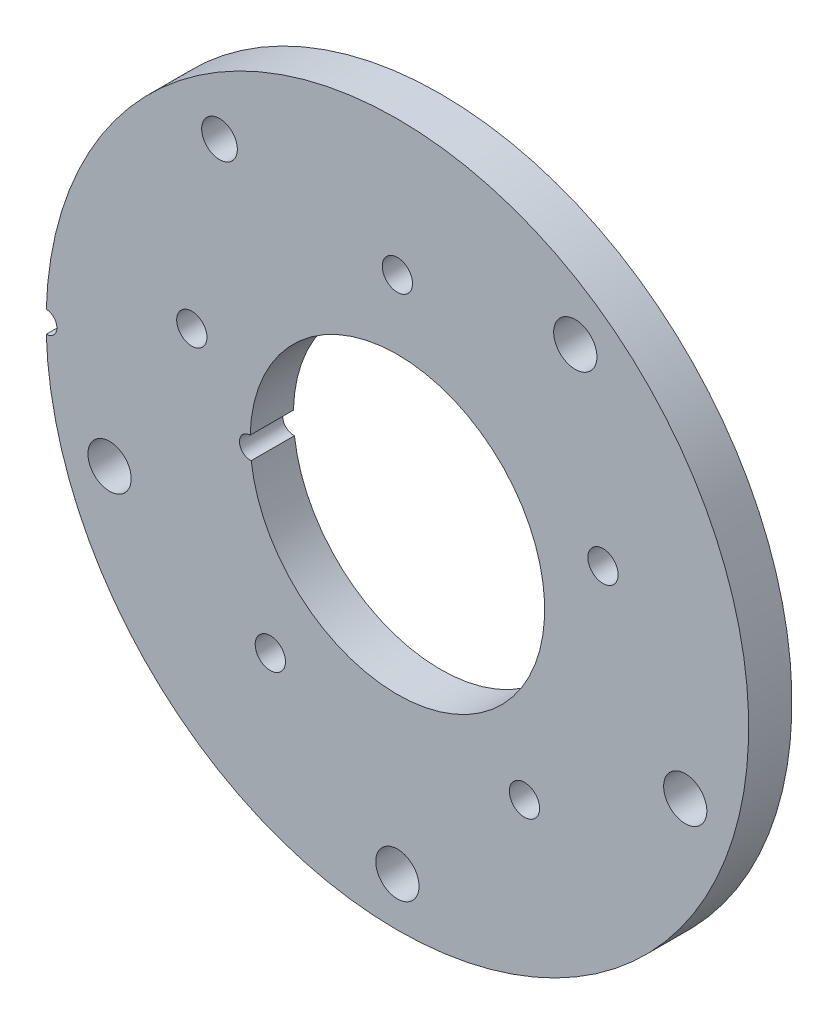
ISO-10303-21;
HEADER;
FILE_DESCRIPTION(('STEP AP214'),'2;1');
FILE_NAME('part.step','',(''),(''),'','','');
FILE_SCHEMA(('AUTOMOTIVE_DESIGN { 1 0 10303 214 1 1 1 1 }'));
ENDSEC;
DATA;
#1=APPLICATION_CONTEXT('core data for automotive mechanical design processes');
#2=APPLICATION_PROTOCOL_DEFINITION('international standard','automotive_design',2000,#1);
#3=PRODUCT_CONTEXT('',#1,'mechanical');
#4=PRODUCT('Part','Part','',(#3));
#5=PRODUCT_RELATED_PRODUCT_CATEGORY('part','',(#4));
#6=PRODUCT_DEFINITION_FORMATION('','',#4);
#7=PRODUCT_DEFINITION_CONTEXT('part definition',#1,'design');
#8=PRODUCT_DEFINITION('design','',#6,#7);
#9=PRODUCT_DEFINITION_SHAPE('','',#8);
#10=(LENGTH_UNIT() NAMED_UNIT(*) SI_UNIT(.MILLI.,.METRE.));
#11=(NAMED_UNIT(*) PLANE_ANGLE_UNIT() SI_UNIT($,.RADIAN.));
#12=(NAMED_UNIT(*) SI_UNIT($,.STERADIAN.) SOLID_ANGLE_UNIT());
#13=UNCERTAINTY_MEASURE_WITH_UNIT(LENGTH_MEASURE(1.E-05),#10,'distance_accuracy_value','');
#14=(GEOMETRIC_REPRESENTATION_CONTEXT(3) GLOBAL_UNCERTAINTY_ASSIGNED_CONTEXT((#13)) GLOBAL_UNIT_ASSIGNED_CONTEXT((#10,
#11,#12)) REPRESENTATION_CONTEXT('',''));
#15=CARTESIAN_POINT('',(0.,0.,0.));
#16=DIRECTION('',(0.,0.,1.));
#17=DIRECTION('',(1.,0.,0.));
#18=AXIS2_PLACEMENT_3D('',#15,#16,#17);
#19=CARTESIAN_POINT('',(-0.261189044756166,0.652972611890443,4.));
#20=DIRECTION('',(0.,0.,1.));
#21=DIRECTION('',(1.,0.,0.));
#22=AXIS2_PLACEMENT_3D('',#19,#20,#21);
#23=PLANE('',#22);
#24=CARTESIAN_POINT('',(-13.8705333260991,0.,4.));
#25=DIRECTION('',(0.,0.,1.));
#26=DIRECTION('',(1.,0.,0.));
#27=AXIS2_PLACEMENT_3D('',#24,#25,#26);
#28=CIRCLE('',#27,1.);
#29=CARTESIAN_POINT('',(-13.8817705598872,0.999936860295086,4.));
#30=VERTEX_POINT('',#29);
#31=CARTESIAN_POINT('',(-13.7859859303712,-0.996419458800179,4.));
#32=VERTEX_POINT('',#31);
#33=EDGE_CURVE('E63',#30,#32,#28,.T.);
#34=ORIENTED_EDGE('',*,*,#33,.F.);
#35=CARTESIAN_POINT('',(-0.261189044756166,0.652972611890443,4.));
#36=DIRECTION('',(0.,0.,1.));
#37=DIRECTION('',(1.,0.,0.));
#38=AXIS2_PLACEMENT_3D('',#35,#36,#37);
#39=CIRCLE('',#38,13.625);
#40=EDGE_CURVE('E93',#32,#30,#39,.T.);
#41=ORIENTED_EDGE('',*,*,#40,.F.);
#42=EDGE_LOOP('',(#34,#41));
#43=FACE_BOUND('',#42,.T.);
#44=CARTESIAN_POINT('',(-32.7611890447562,0.652972611890443,4.));
#45=DIRECTION('',(0.,0.,1.));
#46=DIRECTION('',(1.,0.,0.));
#47=AXIS2_PLACEMENT_3D('',#44,#45,#46);
#48=CIRCLE('',#47,0.999999999999998);
#49=CARTESIAN_POINT('',(-32.7458044293715,-0.346909037910904,4.));
#50=VERTEX_POINT('',#49);
#51=CARTESIAN_POINT('',(-32.7458044293715,1.65285426169179,4.));
#52=VERTEX_POINT('',#51);
#53=EDGE_CURVE('E95',#50,#52,#48,.T.);
#54=ORIENTED_EDGE('',*,*,#53,.F.);
#55=CARTESIAN_POINT('',(-0.261189044756166,0.652972611890443,4.));
#56=DIRECTION('',(0.,0.,1.));
#57=DIRECTION('',(1.,0.,0.));
#58=AXIS2_PLACEMENT_3D('',#55,#56,#57);
#59=CIRCLE('',#58,32.5);
#60=EDGE_CURVE('E105',#50,#52,#59,.T.);
#61=ORIENTED_EDGE('',*,*,#60,.T.);
#62=EDGE_LOOP('',(#54,#61));
#63=FACE_BOUND('',#62,.T.);
#64=CARTESIAN_POINT('',(18.759941281147,6.83331249938919,4.));
#65=DIRECTION('',(0.,0.,1.));
#66=DIRECTION('',(1.,0.,0.));
#67=AXIS2_PLACEMENT_3D('',#64,#65,#66);
#68=CIRCLE('',#67,1.4);
#69=CARTESIAN_POINT('',(20.159941281147,6.83331249938919,4.));
#70=VERTEX_POINT('',#69);
#71=EDGE_CURVE('E140',#70,#70,#68,.T.);
#72=ORIENTED_EDGE('',*,*,#71,.F.);
#73=EDGE_LOOP('',(#72));
#74=FACE_BOUND('',#73,.T.);
#75=CARTESIAN_POINT('',(-19.2823193706592,6.83331249938948,4.));
#76=DIRECTION('',(0.,0.,1.));
#77=DIRECTION('',(1.,0.,0.));
#78=AXIS2_PLACEMENT_3D('',#75,#76,#77);
#79=CIRCLE('',#78,1.4);
#80=CARTESIAN_POINT('',(-17.8823193706592,6.83331249938948,4.));
#81=VERTEX_POINT('',#80);
#82=EDGE_CURVE('E156',#81,#81,#79,.T.);
#83=ORIENTED_EDGE('',*,*,#82,.F.);
#84=EDGE_LOOP('',(#83));
#85=FACE_BOUND('',#84,.T.);
#86=CARTESIAN_POINT('',(26.368393411508,-7.99950323060838,4.));
#87=DIRECTION('',(0.,0.,1.));
#88=DIRECTION('',(1.,0.,0.));
#89=AXIS2_PLACEMENT_3D('',#86,#87,#88);
#90=CIRCLE('',#89,2.);
#91=CARTESIAN_POINT('',(28.368393411508,-7.99950323060838,4.));
#92=VERTEX_POINT('',#91);
#93=EDGE_CURVE('E172',#92,#92,#90,.T.);
#94=ORIENTED_EDGE('',*,*,#93,.F.);
#95=EDGE_LOOP('',(#94));
#96=FACE_BOUND('',#95,.T.);
#97=CARTESIAN_POINT('',(-16.7191761089453,23.3054484543891,4.));
#98=DIRECTION('',(0.,0.,1.));
#99=DIRECTION('',(1.,0.,0.));
#100=AXIS2_PLACEMENT_3D('',#97,#98,#99);
#101=CIRCLE('',#100,1.65);
#102=CARTESIAN_POINT('',(-15.0691761089453,23.3054484543891,4.));
#103=VERTEX_POINT('',#102);
#104=EDGE_CURVE('E188',#103,#103,#101,.T.);
#105=ORIENTED_EDGE('',*,*,#104,.F.);
#106=EDGE_LOOP('',(#105));
#107=FACE_BOUND('',#106,.T.);
#108=CARTESIAN_POINT('',(-0.261189044756163,-27.3470273881096,4.));
#109=DIRECTION('',(0.,0.,1.));
#110=DIRECTION('',(1.,0.,0.));
#111=AXIS2_PLACEMENT_3D('',#108,#109,#110);
#112=CIRCLE('',#111,2.);
#113=CARTESIAN_POINT('',(1.73881095524384,-27.3470273881096,4.));
#114=VERTEX_POINT('',#113);
#115=EDGE_CURVE('E107',#114,#114,#112,.T.);
#116=ORIENTED_EDGE('',*,*,#115,.F.);
#117=EDGE_LOOP('',(#116));
#118=FACE_BOUND('',#117,.T.);
#119=CARTESIAN_POINT('',(-26.8907715010205,-7.99950323060802,4.));
#120=DIRECTION('',(0.,0.,1.));
#121=DIRECTION('',(1.,0.,0.));
#122=AXIS2_PLACEMENT_3D('',#119,#120,#121);
#123=CIRCLE('',#122,2.);
#124=CARTESIAN_POINT('',(-24.8907715010205,-7.99950323060802,4.));
#125=VERTEX_POINT('',#124);
#126=EDGE_CURVE('E196',#125,#125,#123,.T.);
#127=ORIENTED_EDGE('',*,*,#126,.F.);
#128=EDGE_LOOP('',(#127));
#129=FACE_BOUND('',#128,.T.);
#130=CARTESIAN_POINT('',(16.1967980194333,23.3054484543888,4.));
#131=DIRECTION('',(0.,0.,1.));
#132=DIRECTION('',(1.,0.,0.));
#133=AXIS2_PLACEMENT_3D('',#130,#131,#132);
#134=CIRCLE('',#133,2.);
#135=CARTESIAN_POINT('',(18.1967980194333,23.3054484543888,4.));
#136=VERTEX_POINT('',#135);
#137=EDGE_CURVE('E180',#136,#136,#134,.T.);
#138=ORIENTED_EDGE('',*,*,#137,.F.);
#139=EDGE_LOOP('',(#138));
#140=FACE_BOUND('',#139,.T.);
#141=CARTESIAN_POINT('',(-12.0168940906057,-15.5273672756085,4.));
#142=DIRECTION('',(0.,0.,1.));
#143=DIRECTION('',(1.,0.,0.));
#144=AXIS2_PLACEMENT_3D('',#141,#142,#143);
#145=CIRCLE('',#144,1.4);
#146=CARTESIAN_POINT('',(-10.6168940906057,-15.5273672756085,4.));
#147=VERTEX_POINT('',#146);
#148=EDGE_CURVE('E164',#147,#147,#145,.T.);
#149=ORIENTED_EDGE('',*,*,#148,.F.);
#150=EDGE_LOOP('',(#149));
#151=FACE_BOUND('',#150,.T.);
#152=CARTESIAN_POINT('',(-0.261189044756015,20.6529726118904,4.));
#153=DIRECTION('',(0.,0.,1.));
#154=DIRECTION('',(1.,0.,0.));
#155=AXIS2_PLACEMENT_3D('',#152,#153,#154);
#156=CIRCLE('',#155,1.4);
#157=CARTESIAN_POINT('',(1.13881095524398,20.6529726118904,4.));
#158=VERTEX_POINT('',#157);
#159=EDGE_CURVE('E148',#158,#158,#156,.T.);
#160=ORIENTED_EDGE('',*,*,#159,.F.);
#161=EDGE_LOOP('',(#160));
#162=FACE_BOUND('',#161,.T.);
#163=CARTESIAN_POINT('',(11.4945160010931,-15.5273672756087,4.));
#164=DIRECTION('',(0.,0.,1.));
#165=DIRECTION('',(1.,0.,0.));
#166=AXIS2_PLACEMENT_3D('',#163,#164,#165);
#167=CIRCLE('',#166,1.4);
#168=CARTESIAN_POINT('',(12.8945160010931,-15.5273672756087,4.));
#169=VERTEX_POINT('',#168);
#170=EDGE_CURVE('E131',#169,#169,#167,.T.);
#171=ORIENTED_EDGE('',*,*,#170,.F.);
#172=EDGE_LOOP('',(#171));
#173=FACE_BOUND('',#172,.T.);
#174=ADVANCED_FACE('F39',(#43,#63,#74,#85,#96,#107,#118,#129,#140,#151,#162,#173),#23,.T.);
#175=CARTESIAN_POINT('',(-0.261189044756166,0.652972611890443,0.));
#176=DIRECTION('',(0.,0.,1.));
#177=DIRECTION('',(1.,0.,0.));
#178=AXIS2_PLACEMENT_3D('',#175,#176,#177);
#179=PLANE('',#178);
#180=CARTESIAN_POINT('',(-0.261189044756166,0.652972611890443,0.));
#181=DIRECTION('',(0.,0.,1.));
#182=DIRECTION('',(1.,0.,0.));
#183=AXIS2_PLACEMENT_3D('',#180,#181,#182);
#184=CIRCLE('',#183,32.5);
#185=CARTESIAN_POINT('',(-32.7458044293715,-0.346909037910907,0.));
#186=VERTEX_POINT('',#185);
#187=CARTESIAN_POINT('',(-32.7458044293715,1.65285426169196,0.));
#188=VERTEX_POINT('',#187);
#189=EDGE_CURVE('E99',#186,#188,#184,.T.);
#190=ORIENTED_EDGE('',*,*,#189,.F.);
#191=CARTESIAN_POINT('',(-32.7611890447562,0.652972611890443,0.));
#192=DIRECTION('',(0.,0.,1.));
#193=DIRECTION('',(1.,0.,0.));
#194=AXIS2_PLACEMENT_3D('',#191,#192,#193);
#195=CIRCLE('',#194,0.999999999999998);
#196=EDGE_CURVE('E55',#186,#188,#195,.T.);
#197=ORIENTED_EDGE('',*,*,#196,.T.);
#198=EDGE_LOOP('',(#190,#197));
#199=FACE_BOUND('',#198,.T.);
#200=CARTESIAN_POINT('',(-0.261189044756166,0.652972611890443,0.));
#201=DIRECTION('',(0.,0.,1.));
#202=DIRECTION('',(1.,0.,0.));
#203=AXIS2_PLACEMENT_3D('',#200,#201,#202);
#204=CIRCLE('',#203,13.625);
#205=CARTESIAN_POINT('',(-13.7859859303712,-0.996419458800185,0.));
#206=VERTEX_POINT('',#205);
#207=CARTESIAN_POINT('',(-13.8817705598872,0.99993686029508,0.));
#208=VERTEX_POINT('',#207);
#209=EDGE_CURVE('E100',#206,#208,#204,.T.);
#210=ORIENTED_EDGE('',*,*,#209,.T.);
#211=CARTESIAN_POINT('',(-13.8705333260991,0.,0.));
#212=DIRECTION('',(0.,0.,1.));
#213=DIRECTION('',(1.,0.,0.));
#214=AXIS2_PLACEMENT_3D('',#211,#212,#213);
#215=CIRCLE('',#214,1.);
#216=EDGE_CURVE('E82',#208,#206,#215,.T.);
#217=ORIENTED_EDGE('',*,*,#216,.T.);
#218=EDGE_LOOP('',(#210,#217));
#219=FACE_BOUND('',#218,.T.);
#220=CARTESIAN_POINT('',(-0.261189044756163,-27.3470273881096,0.));
#221=DIRECTION('',(0.,0.,1.));
#222=DIRECTION('',(1.,0.,0.));
#223=AXIS2_PLACEMENT_3D('',#220,#221,#222);
#224=CIRCLE('',#223,2.);
#225=CARTESIAN_POINT('',(1.73881095524384,-27.3470273881096,0.));
#226=VERTEX_POINT('',#225);
#227=EDGE_CURVE('E110',#226,#226,#224,.T.);
#228=ORIENTED_EDGE('',*,*,#227,.T.);
#229=EDGE_LOOP('',(#228));
#230=FACE_BOUND('',#229,.T.);
#231=CARTESIAN_POINT('',(-26.8907715010205,-7.99950323060802,0.));
#232=DIRECTION('',(0.,0.,1.));
#233=DIRECTION('',(1.,0.,0.));
#234=AXIS2_PLACEMENT_3D('',#231,#232,#233);
#235=CIRCLE('',#234,2.);
#236=CARTESIAN_POINT('',(-24.8907715010205,-7.99950323060802,0.));
#237=VERTEX_POINT('',#236);
#238=EDGE_CURVE('E192',#237,#237,#235,.T.);
#239=ORIENTED_EDGE('',*,*,#238,.T.);
#240=EDGE_LOOP('',(#239));
#241=FACE_BOUND('',#240,.T.);
#242=CARTESIAN_POINT('',(-16.7191761089453,23.3054484543891,0.));
#243=DIRECTION('',(0.,0.,1.));
#244=DIRECTION('',(1.,0.,0.));
#245=AXIS2_PLACEMENT_3D('',#242,#243,#244);
#246=CIRCLE('',#245,1.65);
#247=CARTESIAN_POINT('',(-15.0691761089453,23.3054484543891,0.));
#248=VERTEX_POINT('',#247);
#249=EDGE_CURVE('E184',#248,#248,#246,.T.);
#250=ORIENTED_EDGE('',*,*,#249,.T.);
#251=EDGE_LOOP('',(#250));
#252=FACE_BOUND('',#251,.T.);
#253=CARTESIAN_POINT('',(16.1967980194333,23.3054484543888,0.));
#254=DIRECTION('',(0.,0.,1.));
#255=DIRECTION('',(1.,0.,0.));
#256=AXIS2_PLACEMENT_3D('',#253,#254,#255);
#257=CIRCLE('',#256,2.);
#258=CARTESIAN_POINT('',(18.1967980194333,23.3054484543888,0.));
#259=VERTEX_POINT('',#258);
#260=EDGE_CURVE('E176',#259,#259,#257,.T.);
#261=ORIENTED_EDGE('',*,*,#260,.T.);
#262=EDGE_LOOP('',(#261));
#263=FACE_BOUND('',#262,.T.);
#264=CARTESIAN_POINT('',(26.368393411508,-7.99950323060838,0.));
#265=DIRECTION('',(0.,0.,1.));
#266=DIRECTION('',(1.,0.,0.));
#267=AXIS2_PLACEMENT_3D('',#264,#265,#266);
#268=CIRCLE('',#267,2.);
#269=CARTESIAN_POINT('',(28.368393411508,-7.99950323060838,0.));
#270=VERTEX_POINT('',#269);
#271=EDGE_CURVE('E168',#270,#270,#268,.T.);
#272=ORIENTED_EDGE('',*,*,#271,.T.);
#273=EDGE_LOOP('',(#272));
#274=FACE_BOUND('',#273,.T.);
#275=CARTESIAN_POINT('',(-12.0168940906057,-15.5273672756085,0.));
#276=DIRECTION('',(0.,0.,1.));
#277=DIRECTION('',(1.,0.,0.));
#278=AXIS2_PLACEMENT_3D('',#275,#276,#277);
#279=CIRCLE('',#278,1.4);
#280=CARTESIAN_POINT('',(-10.6168940906057,-15.5273672756085,0.));
#281=VERTEX_POINT('',#280);
#282=EDGE_CURVE('E160',#281,#281,#279,.T.);
#283=ORIENTED_EDGE('',*,*,#282,.T.);
#284=EDGE_LOOP('',(#283));
#285=FACE_BOUND('',#284,.T.);
#286=CARTESIAN_POINT('',(-19.2823193706592,6.83331249938948,0.));
#287=DIRECTION('',(0.,0.,1.));
#288=DIRECTION('',(1.,0.,0.));
#289=AXIS2_PLACEMENT_3D('',#286,#287,#288);
#290=CIRCLE('',#289,1.4);
#291=CARTESIAN_POINT('',(-17.8823193706592,6.83331249938948,0.));
#292=VERTEX_POINT('',#291);
#293=EDGE_CURVE('E152',#292,#292,#290,.T.);
#294=ORIENTED_EDGE('',*,*,#293,.T.);
#295=EDGE_LOOP('',(#294));
#296=FACE_BOUND('',#295,.T.);
#297=CARTESIAN_POINT('',(-0.261189044756015,20.6529726118904,0.));
#298=DIRECTION('',(0.,0.,1.));
#299=DIRECTION('',(1.,0.,0.));
#300=AXIS2_PLACEMENT_3D('',#297,#298,#299);
#301=CIRCLE('',#300,1.4);
#302=CARTESIAN_POINT('',(1.13881095524398,20.6529726118904,0.));
#303=VERTEX_POINT('',#302);
#304=EDGE_CURVE('E144',#303,#303,#301,.T.);
#305=ORIENTED_EDGE('',*,*,#304,.T.);
#306=EDGE_LOOP('',(#305));
#307=FACE_BOUND('',#306,.T.);
#308=CARTESIAN_POINT('',(18.759941281147,6.83331249938919,0.));
#309=DIRECTION('',(0.,0.,1.));
#310=DIRECTION('',(1.,0.,0.));
#311=AXIS2_PLACEMENT_3D('',#308,#309,#310);
#312=CIRCLE('',#311,1.4);
#313=CARTESIAN_POINT('',(20.159941281147,6.83331249938919,0.));
#314=VERTEX_POINT('',#313);
#315=EDGE_CURVE('E138',#314,#314,#312,.T.);
#316=ORIENTED_EDGE('',*,*,#315,.T.);
#317=EDGE_LOOP('',(#316));
#318=FACE_BOUND('',#317,.T.);
#319=CARTESIAN_POINT('',(11.4945160010931,-15.5273672756087,0.));
#320=DIRECTION('',(0.,0.,1.));
#321=DIRECTION('',(1.,0.,0.));
#322=AXIS2_PLACEMENT_3D('',#319,#320,#321);
#323=CIRCLE('',#322,1.4);
#324=CARTESIAN_POINT('',(12.8945160010931,-15.5273672756087,0.));
#325=VERTEX_POINT('',#324);
#326=EDGE_CURVE('E126',#325,#325,#323,.T.);
#327=ORIENTED_EDGE('',*,*,#326,.T.);
#328=EDGE_LOOP('',(#327));
#329=FACE_BOUND('',#328,.T.);
#330=ADVANCED_FACE('F123',(#199,#219,#230,#241,#252,#263,#274,#285,#296,#307,#318,#329),#179,.F.);
#331=CARTESIAN_POINT('',(-0.261189044756166,0.652972611890443,4.));
#332=DIRECTION('',(0.,0.,-1.));
#333=DIRECTION('',(-1.,0.,0.));
#334=AXIS2_PLACEMENT_3D('',#331,#332,#333);
#335=CYLINDRICAL_SURFACE('',#334,32.5);
#336=ORIENTED_EDGE('',*,*,#189,.T.);
#337=DIRECTION('',(0.,0.,1.));
#338=VECTOR('',#337,1.);
#339=CARTESIAN_POINT('',(-32.7458044293715,1.65285426169179,-1.));
#340=LINE('',#339,#338);
#341=EDGE_CURVE('E11',#188,#52,#340,.T.);
#342=ORIENTED_EDGE('',*,*,#341,.T.);
#343=ORIENTED_EDGE('',*,*,#60,.F.);
#344=DIRECTION('',(0.,0.,1.));
#345=VECTOR('',#344,1.);
#346=CARTESIAN_POINT('',(-32.7458044293715,-0.346909037910904,-1.));
#347=LINE('',#346,#345);
#348=EDGE_CURVE('E48',#50,#186,#347,.F.);
#349=ORIENTED_EDGE('',*,*,#348,.T.);
#350=EDGE_LOOP('',(#336,#342,#343,#349));
#351=FACE_BOUND('',#350,.T.);
#352=ADVANCED_FACE('F41',(#351),#335,.T.);
#353=CARTESIAN_POINT('',(-0.261189044756166,0.652972611890443,4.));
#354=DIRECTION('',(0.,0.,-1.));
#355=DIRECTION('',(-1.,0.,0.));
#356=AXIS2_PLACEMENT_3D('',#353,#354,#355);
#357=CYLINDRICAL_SURFACE('',#356,13.625);
#358=DIRECTION('',(0.,0.,1.));
#359=VECTOR('',#358,1.);
#360=CARTESIAN_POINT('',(-13.8817705598872,0.999936860295086,-1.));
#361=LINE('',#360,#359);
#362=EDGE_CURVE('E79',#208,#30,#361,.T.);
#363=ORIENTED_EDGE('',*,*,#362,.F.);
#364=ORIENTED_EDGE('',*,*,#209,.F.);
#365=DIRECTION('',(0.,0.,1.));
#366=VECTOR('',#365,1.);
#367=CARTESIAN_POINT('',(-13.7859859303712,-0.996419458800179,-1.));
#368=LINE('',#367,#366);
#369=EDGE_CURVE('E88',#32,#206,#368,.F.);
#370=ORIENTED_EDGE('',*,*,#369,.F.);
#371=ORIENTED_EDGE('',*,*,#40,.T.);
#372=EDGE_LOOP('',(#363,#364,#370,#371));
#373=FACE_BOUND('',#372,.T.);
#374=ADVANCED_FACE('F97',(#373),#357,.F.);
#375=CARTESIAN_POINT('',(-0.261189044756163,-27.3470273881096,4.));
#376=DIRECTION('',(0.,0.,-1.));
#377=DIRECTION('',(-1.,0.,0.));
#378=AXIS2_PLACEMENT_3D('',#375,#376,#377);
#379=CYLINDRICAL_SURFACE('',#378,2.);
#380=ORIENTED_EDGE('',*,*,#115,.T.);
#381=EDGE_LOOP('',(#380));
#382=FACE_BOUND('',#381,.T.);
#383=ORIENTED_EDGE('',*,*,#227,.F.);
#384=EDGE_LOOP('',(#383));
#385=FACE_BOUND('',#384,.T.);
#386=ADVANCED_FACE('F212',(#382,#385),#379,.F.);
#387=CARTESIAN_POINT('',(-26.8907715010205,-7.99950323060802,4.));
#388=DIRECTION('',(0.,0.,-1.));
#389=DIRECTION('',(-1.,0.,0.));
#390=AXIS2_PLACEMENT_3D('',#387,#388,#389);
#391=CYLINDRICAL_SURFACE('',#390,2.);
#392=ORIENTED_EDGE('',*,*,#126,.T.);
#393=EDGE_LOOP('',(#392));
#394=FACE_BOUND('',#393,.T.);
#395=ORIENTED_EDGE('',*,*,#238,.F.);
#396=EDGE_LOOP('',(#395));
#397=FACE_BOUND('',#396,.T.);
#398=ADVANCED_FACE('F214',(#394,#397),#391,.F.);
#399=CARTESIAN_POINT('',(-16.7191761089453,23.3054484543891,4.));
#400=DIRECTION('',(0.,0.,-1.));
#401=DIRECTION('',(-1.,0.,0.));
#402=AXIS2_PLACEMENT_3D('',#399,#400,#401);
#403=CYLINDRICAL_SURFACE('',#402,1.65);
#404=ORIENTED_EDGE('',*,*,#104,.T.);
#405=EDGE_LOOP('',(#404));
#406=FACE_BOUND('',#405,.T.);
#407=ORIENTED_EDGE('',*,*,#249,.F.);
#408=EDGE_LOOP('',(#407));
#409=FACE_BOUND('',#408,.T.);
#410=ADVANCED_FACE('F220',(#406,#409),#403,.F.);
#411=CARTESIAN_POINT('',(16.1967980194333,23.3054484543888,4.));
#412=DIRECTION('',(0.,0.,-1.));
#413=DIRECTION('',(-1.,0.,0.));
#414=AXIS2_PLACEMENT_3D('',#411,#412,#413);
#415=CYLINDRICAL_SURFACE('',#414,2.);
#416=ORIENTED_EDGE('',*,*,#137,.T.);
#417=EDGE_LOOP('',(#416));
#418=FACE_BOUND('',#417,.T.);
#419=ORIENTED_EDGE('',*,*,#260,.F.);
#420=EDGE_LOOP('',(#419));
#421=FACE_BOUND('',#420,.T.);
#422=ADVANCED_FACE('F285',(#418,#421),#415,.F.);
#423=CARTESIAN_POINT('',(26.368393411508,-7.99950323060838,4.));
#424=DIRECTION('',(0.,0.,-1.));
#425=DIRECTION('',(-1.,0.,0.));
#426=AXIS2_PLACEMENT_3D('',#423,#424,#425);
#427=CYLINDRICAL_SURFACE('',#426,2.);
#428=ORIENTED_EDGE('',*,*,#93,.T.);
#429=EDGE_LOOP('',(#428));
#430=FACE_BOUND('',#429,.T.);
#431=ORIENTED_EDGE('',*,*,#271,.F.);
#432=EDGE_LOOP('',(#431));
#433=FACE_BOUND('',#432,.T.);
#434=ADVANCED_FACE('F281',(#430,#433),#427,.F.);
#435=CARTESIAN_POINT('',(-12.0168940906057,-15.5273672756085,4.));
#436=DIRECTION('',(0.,0.,-1.));
#437=DIRECTION('',(-1.,0.,0.));
#438=AXIS2_PLACEMENT_3D('',#435,#436,#437);
#439=CYLINDRICAL_SURFACE('',#438,1.4);
#440=ORIENTED_EDGE('',*,*,#148,.T.);
#441=EDGE_LOOP('',(#440));
#442=FACE_BOUND('',#441,.T.);
#443=ORIENTED_EDGE('',*,*,#282,.F.);
#444=EDGE_LOOP('',(#443));
#445=FACE_BOUND('',#444,.T.);
#446=ADVANCED_FACE('F277',(#442,#445),#439,.F.);
#447=CARTESIAN_POINT('',(-19.2823193706592,6.83331249938948,4.));
#448=DIRECTION('',(0.,0.,-1.));
#449=DIRECTION('',(-1.,0.,0.));
#450=AXIS2_PLACEMENT_3D('',#447,#448,#449);
#451=CYLINDRICAL_SURFACE('',#450,1.4);
#452=ORIENTED_EDGE('',*,*,#82,.T.);
#453=EDGE_LOOP('',(#452));
#454=FACE_BOUND('',#453,.T.);
#455=ORIENTED_EDGE('',*,*,#293,.F.);
#456=EDGE_LOOP('',(#455));
#457=FACE_BOUND('',#456,.T.);
#458=ADVANCED_FACE('F273',(#454,#457),#451,.F.);
#459=CARTESIAN_POINT('',(-0.261189044756015,20.6529726118904,4.));
#460=DIRECTION('',(0.,0.,-1.));
#461=DIRECTION('',(-1.,0.,0.));
#462=AXIS2_PLACEMENT_3D('',#459,#460,#461);
#463=CYLINDRICAL_SURFACE('',#462,1.4);
#464=ORIENTED_EDGE('',*,*,#159,.T.);
#465=EDGE_LOOP('',(#464));
#466=FACE_BOUND('',#465,.T.);
#467=ORIENTED_EDGE('',*,*,#304,.F.);
#468=EDGE_LOOP('',(#467));
#469=FACE_BOUND('',#468,.T.);
#470=ADVANCED_FACE('F269',(#466,#469),#463,.F.);
#471=CARTESIAN_POINT('',(18.759941281147,6.83331249938919,4.));
#472=DIRECTION('',(0.,0.,-1.));
#473=DIRECTION('',(-1.,0.,0.));
#474=AXIS2_PLACEMENT_3D('',#471,#472,#473);
#475=CYLINDRICAL_SURFACE('',#474,1.4);
#476=ORIENTED_EDGE('',*,*,#71,.T.);
#477=EDGE_LOOP('',(#476));
#478=FACE_BOUND('',#477,.T.);
#479=ORIENTED_EDGE('',*,*,#315,.F.);
#480=EDGE_LOOP('',(#479));
#481=FACE_BOUND('',#480,.T.);
#482=ADVANCED_FACE('F265',(#478,#481),#475,.F.);
#483=CARTESIAN_POINT('',(11.4945160010931,-15.5273672756087,4.));
#484=DIRECTION('',(0.,0.,-1.));
#485=DIRECTION('',(-1.,0.,0.));
#486=AXIS2_PLACEMENT_3D('',#483,#484,#485);
#487=CYLINDRICAL_SURFACE('',#486,1.4);
#488=ORIENTED_EDGE('',*,*,#170,.T.);
#489=EDGE_LOOP('',(#488));
#490=FACE_BOUND('',#489,.T.);
#491=ORIENTED_EDGE('',*,*,#326,.F.);
#492=EDGE_LOOP('',(#491));
#493=FACE_BOUND('',#492,.T.);
#494=ADVANCED_FACE('F249',(#490,#493),#487,.F.);
#495=CARTESIAN_POINT('',(-13.8705333260991,0.,-6.));
#496=DIRECTION('',(0.,0.,1.));
#497=DIRECTION('',(1.,0.,0.));
#498=AXIS2_PLACEMENT_3D('',#495,#496,#497);
#499=CYLINDRICAL_SURFACE('',#498,1.);
#500=ORIENTED_EDGE('',*,*,#362,.T.);
#501=ORIENTED_EDGE('',*,*,#33,.T.);
#502=ORIENTED_EDGE('',*,*,#369,.T.);
#503=ORIENTED_EDGE('',*,*,#216,.F.);
#504=EDGE_LOOP('',(#500,#501,#502,#503));
#505=FACE_BOUND('',#504,.T.);
#506=ADVANCED_FACE('F80',(#505),#499,.F.);
#507=CARTESIAN_POINT('',(-32.7611890447562,0.652972611890443,-6.));
#508=DIRECTION('',(0.,0.,1.));
#509=DIRECTION('',(1.,0.,0.));
#510=AXIS2_PLACEMENT_3D('',#507,#508,#509);
#511=CYLINDRICAL_SURFACE('',#510,0.999999999999998);
#512=ORIENTED_EDGE('',*,*,#196,.F.);
#513=ORIENTED_EDGE('',*,*,#348,.F.);
#514=ORIENTED_EDGE('',*,*,#53,.T.);
#515=ORIENTED_EDGE('',*,*,#341,.F.);
#516=EDGE_LOOP('',(#512,#513,#514,#515));
#517=FACE_BOUND('',#516,.T.);
#518=ADVANCED_FACE('F248',(#517),#511,.F.);
#519=CLOSED_SHELL('',(#174,#330,#352,#374,#386,#398,#410,#422,#434,#446,#458,#470,#482,#494,
#506,#518));
#520=MANIFOLD_SOLID_BREP('B2',#519);
#521=ADVANCED_BREP_SHAPE_REPRESENTATION('',(#18,#520),#14);
#522=SHAPE_DEFINITION_REPRESENTATION(#9,#521);
ENDSEC;
END-ISO-10303-21;
